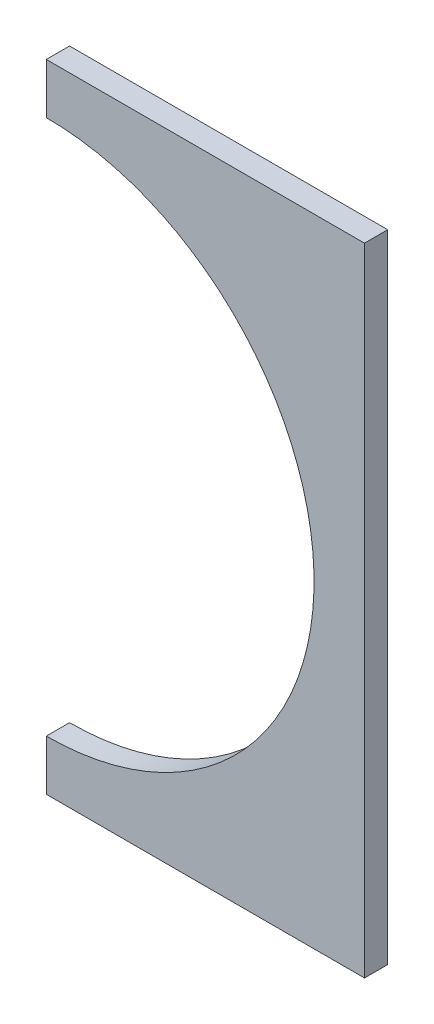
ISO-10303-21;
HEADER;
FILE_DESCRIPTION(('STEP AP214'),'2;1');
FILE_NAME('part.step','',(''),(''),'','','');
FILE_SCHEMA(('AUTOMOTIVE_DESIGN { 1 0 10303 214 1 1 1 1 }'));
ENDSEC;
DATA;
#1=APPLICATION_CONTEXT('core data for automotive mechanical design processes');
#2=APPLICATION_PROTOCOL_DEFINITION('international standard','automotive_design',2000,#1);
#3=PRODUCT_CONTEXT('',#1,'mechanical');
#4=PRODUCT('Part','Part','',(#3));
#5=PRODUCT_RELATED_PRODUCT_CATEGORY('part','',(#4));
#6=PRODUCT_DEFINITION_FORMATION('','',#4);
#7=PRODUCT_DEFINITION_CONTEXT('part definition',#1,'design');
#8=PRODUCT_DEFINITION('design','',#6,#7);
#9=PRODUCT_DEFINITION_SHAPE('','',#8);
#10=(LENGTH_UNIT() NAMED_UNIT(*) SI_UNIT(.MILLI.,.METRE.));
#11=(NAMED_UNIT(*) PLANE_ANGLE_UNIT() SI_UNIT($,.RADIAN.));
#12=(NAMED_UNIT(*) SI_UNIT($,.STERADIAN.) SOLID_ANGLE_UNIT());
#13=UNCERTAINTY_MEASURE_WITH_UNIT(LENGTH_MEASURE(1.E-05),#10,'distance_accuracy_value','');
#14=(GEOMETRIC_REPRESENTATION_CONTEXT(3) GLOBAL_UNCERTAINTY_ASSIGNED_CONTEXT((#13)) GLOBAL_UNIT_ASSIGNED_CONTEXT((#10,
#11,#12)) REPRESENTATION_CONTEXT('',''));
#15=CARTESIAN_POINT('',(0.,0.,0.));
#16=DIRECTION('',(0.,0.,1.));
#17=DIRECTION('',(1.,0.,0.));
#18=AXIS2_PLACEMENT_3D('',#15,#16,#17);
#19=CARTESIAN_POINT('',(0.,0.,6.));
#20=DIRECTION('',(0.,0.,-1.));
#21=DIRECTION('',(-1.,0.,0.));
#22=AXIS2_PLACEMENT_3D('',#19,#20,#21);
#23=CYLINDRICAL_SURFACE('',#22,69.05);
#24=CARTESIAN_POINT('',(0.,0.,0.));
#25=DIRECTION('',(0.,0.,1.));
#26=DIRECTION('',(1.,0.,0.));
#27=AXIS2_PLACEMENT_3D('',#24,#25,#26);
#28=CIRCLE('',#27,69.05);
#29=CARTESIAN_POINT('',(0.,-69.05,0.));
#30=VERTEX_POINT('',#29);
#31=CARTESIAN_POINT('',(0.,69.05,0.));
#32=VERTEX_POINT('',#31);
#33=EDGE_CURVE('E125',#30,#32,#28,.T.);
#34=ORIENTED_EDGE('',*,*,#33,.F.);
#35=DIRECTION('',(0.,0.,-1.));
#36=VECTOR('',#35,1.);
#37=CARTESIAN_POINT('',(0.,-69.05,6.));
#38=LINE('',#37,#36);
#39=CARTESIAN_POINT('',(0.,-69.05,6.));
#40=VERTEX_POINT('',#39);
#41=EDGE_CURVE('E11',#40,#30,#38,.T.);
#42=ORIENTED_EDGE('',*,*,#41,.F.);
#43=CARTESIAN_POINT('',(0.,0.,6.));
#44=DIRECTION('',(0.,0.,1.));
#45=DIRECTION('',(1.,0.,0.));
#46=AXIS2_PLACEMENT_3D('',#43,#44,#45);
#47=CIRCLE('',#46,69.05);
#48=CARTESIAN_POINT('',(0.,69.05,6.));
#49=VERTEX_POINT('',#48);
#50=EDGE_CURVE('E148',#40,#49,#47,.T.);
#51=ORIENTED_EDGE('',*,*,#50,.T.);
#52=DIRECTION('',(0.,0.,-1.));
#53=VECTOR('',#52,1.);
#54=CARTESIAN_POINT('',(0.,69.05,6.));
#55=LINE('',#54,#53);
#56=EDGE_CURVE('E87',#49,#32,#55,.T.);
#57=ORIENTED_EDGE('',*,*,#56,.T.);
#58=EDGE_LOOP('',(#34,#42,#51,#57));
#59=FACE_BOUND('',#58,.T.);
#60=ADVANCED_FACE('F43',(#59),#23,.F.);
#61=CARTESIAN_POINT('',(0.,0.,6.));
#62=DIRECTION('',(1.,0.,0.));
#63=DIRECTION('',(0.,1.,0.));
#64=AXIS2_PLACEMENT_3D('',#61,#62,#63);
#65=PLANE('',#64);
#66=DIRECTION('',(0.,-1.,0.));
#67=VECTOR('',#66,1.);
#68=CARTESIAN_POINT('',(0.,0.,0.));
#69=LINE('',#68,#67);
#70=CARTESIAN_POINT('',(0.,-82.05,0.));
#71=VERTEX_POINT('',#70);
#72=EDGE_CURVE('E128',#30,#71,#69,.T.);
#73=ORIENTED_EDGE('',*,*,#72,.T.);
#74=DIRECTION('',(0.,0.,-1.));
#75=VECTOR('',#74,1.);
#76=CARTESIAN_POINT('',(0.,-82.05,6.));
#77=LINE('',#76,#75);
#78=CARTESIAN_POINT('',(0.,-82.05,6.));
#79=VERTEX_POINT('',#78);
#80=EDGE_CURVE('E51',#79,#71,#77,.T.);
#81=ORIENTED_EDGE('',*,*,#80,.F.);
#82=DIRECTION('',(0.,-1.,0.));
#83=VECTOR('',#82,1.);
#84=CARTESIAN_POINT('',(0.,0.,6.));
#85=LINE('',#84,#83);
#86=EDGE_CURVE('E122',#40,#79,#85,.T.);
#87=ORIENTED_EDGE('',*,*,#86,.F.);
#88=ORIENTED_EDGE('',*,*,#41,.T.);
#89=EDGE_LOOP('',(#73,#81,#87,#88));
#90=FACE_BOUND('',#89,.T.);
#91=ADVANCED_FACE('F150',(#90),#65,.F.);
#92=CARTESIAN_POINT('',(0.,-82.05,6.));
#93=DIRECTION('',(0.,1.,0.));
#94=DIRECTION('',(0.,0.,1.));
#95=AXIS2_PLACEMENT_3D('',#92,#93,#94);
#96=PLANE('',#95);
#97=DIRECTION('',(1.,0.,0.));
#98=VECTOR('',#97,1.);
#99=CARTESIAN_POINT('',(0.,-82.05,0.));
#100=LINE('',#99,#98);
#101=CARTESIAN_POINT('',(82.05,-82.05,0.));
#102=VERTEX_POINT('',#101);
#103=EDGE_CURVE('E130',#71,#102,#100,.T.);
#104=ORIENTED_EDGE('',*,*,#103,.T.);
#105=DIRECTION('',(0.,0.,-1.));
#106=VECTOR('',#105,1.);
#107=CARTESIAN_POINT('',(82.05,-82.05,6.));
#108=LINE('',#107,#106);
#109=CARTESIAN_POINT('',(82.05,-82.05,6.));
#110=VERTEX_POINT('',#109);
#111=EDGE_CURVE('E111',#110,#102,#108,.T.);
#112=ORIENTED_EDGE('',*,*,#111,.F.);
#113=DIRECTION('',(1.,0.,0.));
#114=VECTOR('',#113,1.);
#115=CARTESIAN_POINT('',(0.,-82.05,6.));
#116=LINE('',#115,#114);
#117=EDGE_CURVE('E116',#79,#110,#116,.T.);
#118=ORIENTED_EDGE('',*,*,#117,.F.);
#119=ORIENTED_EDGE('',*,*,#80,.T.);
#120=EDGE_LOOP('',(#104,#112,#118,#119));
#121=FACE_BOUND('',#120,.T.);
#122=ADVANCED_FACE('F143',(#121),#96,.F.);
#123=CARTESIAN_POINT('',(82.05,0.,6.));
#124=DIRECTION('',(1.,0.,0.));
#125=DIRECTION('',(0.,1.,0.));
#126=AXIS2_PLACEMENT_3D('',#123,#124,#125);
#127=PLANE('',#126);
#128=DIRECTION('',(0.,-1.,0.));
#129=VECTOR('',#128,1.);
#130=CARTESIAN_POINT('',(82.05,0.,0.));
#131=LINE('',#130,#129);
#132=CARTESIAN_POINT('',(82.05,82.05,0.));
#133=VERTEX_POINT('',#132);
#134=EDGE_CURVE('E106',#133,#102,#131,.T.);
#135=ORIENTED_EDGE('',*,*,#134,.F.);
#136=DIRECTION('',(0.,0.,-1.));
#137=VECTOR('',#136,1.);
#138=CARTESIAN_POINT('',(82.05,82.05,6.));
#139=LINE('',#138,#137);
#140=CARTESIAN_POINT('',(82.05,82.05,6.));
#141=VERTEX_POINT('',#140);
#142=EDGE_CURVE('E101',#141,#133,#139,.T.);
#143=ORIENTED_EDGE('',*,*,#142,.F.);
#144=DIRECTION('',(0.,-1.,0.));
#145=VECTOR('',#144,1.);
#146=CARTESIAN_POINT('',(82.05,0.,6.));
#147=LINE('',#146,#145);
#148=EDGE_CURVE('E104',#141,#110,#147,.T.);
#149=ORIENTED_EDGE('',*,*,#148,.T.);
#150=ORIENTED_EDGE('',*,*,#111,.T.);
#151=EDGE_LOOP('',(#135,#143,#149,#150));
#152=FACE_BOUND('',#151,.T.);
#153=ADVANCED_FACE('F103',(#152),#127,.T.);
#154=CARTESIAN_POINT('',(0.,82.05,6.));
#155=DIRECTION('',(0.,1.,0.));
#156=DIRECTION('',(0.,0.,1.));
#157=AXIS2_PLACEMENT_3D('',#154,#155,#156);
#158=PLANE('',#157);
#159=DIRECTION('',(1.,0.,0.));
#160=VECTOR('',#159,1.);
#161=CARTESIAN_POINT('',(0.,82.05,0.));
#162=LINE('',#161,#160);
#163=CARTESIAN_POINT('',(0.,82.05,0.));
#164=VERTEX_POINT('',#163);
#165=EDGE_CURVE('E135',#164,#133,#162,.T.);
#166=ORIENTED_EDGE('',*,*,#165,.F.);
#167=DIRECTION('',(0.,0.,-1.));
#168=VECTOR('',#167,1.);
#169=CARTESIAN_POINT('',(0.,82.05,6.));
#170=LINE('',#169,#168);
#171=CARTESIAN_POINT('',(0.,82.05,6.));
#172=VERTEX_POINT('',#171);
#173=EDGE_CURVE('E80',#172,#164,#170,.T.);
#174=ORIENTED_EDGE('',*,*,#173,.F.);
#175=DIRECTION('',(1.,0.,0.));
#176=VECTOR('',#175,1.);
#177=CARTESIAN_POINT('',(0.,82.05,6.));
#178=LINE('',#177,#176);
#179=EDGE_CURVE('E114',#172,#141,#178,.T.);
#180=ORIENTED_EDGE('',*,*,#179,.T.);
#181=ORIENTED_EDGE('',*,*,#142,.T.);
#182=EDGE_LOOP('',(#166,#174,#180,#181));
#183=FACE_BOUND('',#182,.T.);
#184=ADVANCED_FACE('F119',(#183),#158,.T.);
#185=EDGE_CURVE('E131',#164,#32,#69,.T.);
#186=ORIENTED_EDGE('',*,*,#185,.T.);
#187=ORIENTED_EDGE('',*,*,#56,.F.);
#188=EDGE_CURVE('E59',#172,#49,#85,.T.);
#189=ORIENTED_EDGE('',*,*,#188,.F.);
#190=ORIENTED_EDGE('',*,*,#173,.T.);
#191=EDGE_LOOP('',(#186,#187,#189,#190));
#192=FACE_BOUND('',#191,.T.);
#193=ADVANCED_FACE('F153',(#192),#65,.F.);
#194=CARTESIAN_POINT('',(0.,0.,6.));
#195=DIRECTION('',(0.,0.,1.));
#196=DIRECTION('',(1.,0.,0.));
#197=AXIS2_PLACEMENT_3D('',#194,#195,#196);
#198=PLANE('',#197);
#199=ORIENTED_EDGE('',*,*,#50,.F.);
#200=ORIENTED_EDGE('',*,*,#86,.T.);
#201=ORIENTED_EDGE('',*,*,#117,.T.);
#202=ORIENTED_EDGE('',*,*,#148,.F.);
#203=ORIENTED_EDGE('',*,*,#179,.F.);
#204=ORIENTED_EDGE('',*,*,#188,.T.);
#205=EDGE_LOOP('',(#199,#200,#201,#202,#203,#204));
#206=FACE_BOUND('',#205,.T.);
#207=ADVANCED_FACE('F113',(#206),#198,.T.);
#208=CARTESIAN_POINT('',(0.,0.,0.));
#209=DIRECTION('',(0.,0.,1.));
#210=DIRECTION('',(1.,0.,0.));
#211=AXIS2_PLACEMENT_3D('',#208,#209,#210);
#212=PLANE('',#211);
#213=ORIENTED_EDGE('',*,*,#33,.T.);
#214=ORIENTED_EDGE('',*,*,#185,.F.);
#215=ORIENTED_EDGE('',*,*,#165,.T.);
#216=ORIENTED_EDGE('',*,*,#134,.T.);
#217=ORIENTED_EDGE('',*,*,#103,.F.);
#218=ORIENTED_EDGE('',*,*,#72,.F.);
#219=EDGE_LOOP('',(#213,#214,#215,#216,#217,#218));
#220=FACE_BOUND('',#219,.T.);
#221=ADVANCED_FACE('F147',(#220),#212,.F.);
#222=CLOSED_SHELL('',(#60,#91,#122,#153,#184,#193,#207,#221));
#223=MANIFOLD_SOLID_BREP('B2',#222);
#224=ADVANCED_BREP_SHAPE_REPRESENTATION('',(#18,#223),#14);
#225=SHAPE_DEFINITION_REPRESENTATION(#9,#224);
ENDSEC;
END-ISO-10303-21;
